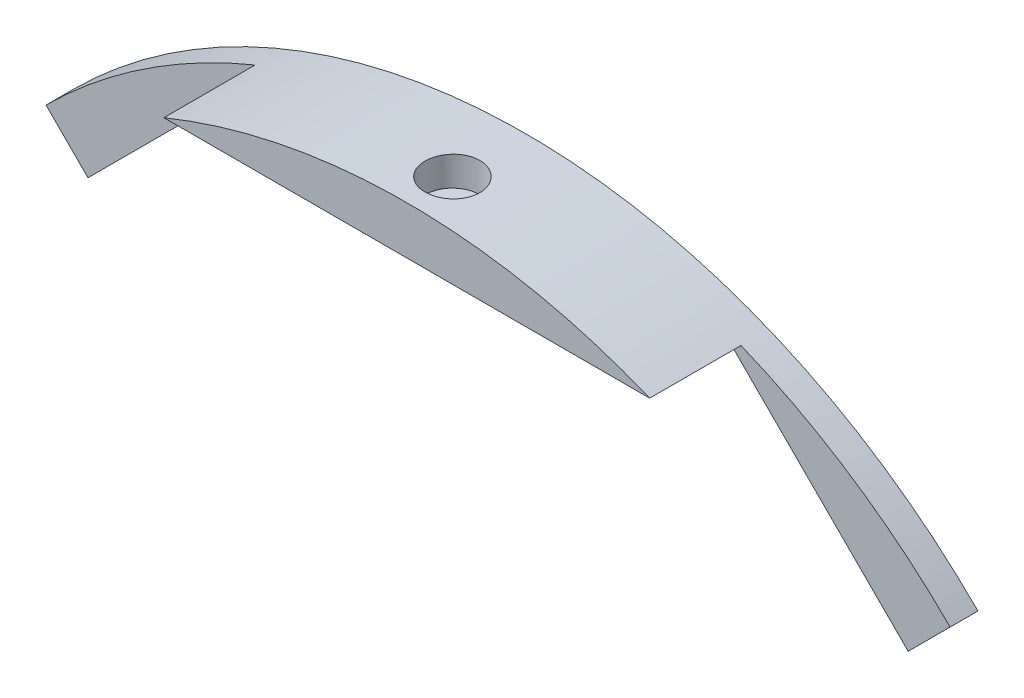
ISO-10303-21;
HEADER;
FILE_DESCRIPTION(('STEP AP214'),'2;1');
FILE_NAME('part.step','',(''),(''),'','','');
FILE_SCHEMA(('AUTOMOTIVE_DESIGN { 1 0 10303 214 1 1 1 1 }'));
ENDSEC;
DATA;
#1=APPLICATION_CONTEXT('core data for automotive mechanical design processes');
#2=APPLICATION_PROTOCOL_DEFINITION('international standard','automotive_design',2000,#1);
#3=PRODUCT_CONTEXT('',#1,'mechanical');
#4=PRODUCT('Part','Part','',(#3));
#5=PRODUCT_RELATED_PRODUCT_CATEGORY('part','',(#4));
#6=PRODUCT_DEFINITION_FORMATION('','',#4);
#7=PRODUCT_DEFINITION_CONTEXT('part definition',#1,'design');
#8=PRODUCT_DEFINITION('design','',#6,#7);
#9=PRODUCT_DEFINITION_SHAPE('','',#8);
#10=(LENGTH_UNIT() NAMED_UNIT(*) SI_UNIT(.MILLI.,.METRE.));
#11=(NAMED_UNIT(*) PLANE_ANGLE_UNIT() SI_UNIT($,.RADIAN.));
#12=(NAMED_UNIT(*) SI_UNIT($,.STERADIAN.) SOLID_ANGLE_UNIT());
#13=UNCERTAINTY_MEASURE_WITH_UNIT(LENGTH_MEASURE(1.E-05),#10,'distance_accuracy_value','');
#14=(GEOMETRIC_REPRESENTATION_CONTEXT(3) GLOBAL_UNCERTAINTY_ASSIGNED_CONTEXT((#13)) GLOBAL_UNIT_ASSIGNED_CONTEXT((#10,
#11,#12)) REPRESENTATION_CONTEXT('',''));
#15=CARTESIAN_POINT('',(0.,0.,0.));
#16=DIRECTION('',(0.,0.,1.));
#17=DIRECTION('',(1.,0.,0.));
#18=AXIS2_PLACEMENT_3D('',#15,#16,#17);
#19=CARTESIAN_POINT('',(1.23866037892397E-11,1.24063554245807E-11,0.));
#20=DIRECTION('',(0.,0.,1.));
#21=DIRECTION('',(1.,0.,0.));
#22=AXIS2_PLACEMENT_3D('',#19,#20,#21);
#23=PLANE('',#22);
#24=DIRECTION('',(1.,0.,0.));
#25=VECTOR('',#24,1.);
#26=CARTESIAN_POINT('',(0.,129.5,0.));
#27=LINE('',#26,#25);
#28=CARTESIAN_POINT('',(-53.1953945375152,129.5,0.));
#29=VERTEX_POINT('',#28);
#30=CARTESIAN_POINT('',(-50.1051224213829,129.5,0.));
#31=VERTEX_POINT('',#30);
#32=EDGE_CURVE('E51',#29,#31,#27,.T.);
#33=ORIENTED_EDGE('',*,*,#32,.F.);
#34=CARTESIAN_POINT('',(1.23866037892397E-11,1.24063554245807E-11,0.));
#35=DIRECTION('',(0.,0.,1.));
#36=DIRECTION('',(1.,0.,0.));
#37=AXIS2_PLACEMENT_3D('',#34,#35,#36);
#38=CIRCLE('',#37,140.);
#39=CARTESIAN_POINT('',(-98.9949493661174,98.994949366116,0.));
#40=VERTEX_POINT('',#39);
#41=EDGE_CURVE('E142',#29,#40,#38,.T.);
#42=ORIENTED_EDGE('',*,*,#41,.T.);
#43=DIRECTION('',(0.70710678118657,-0.707106781186525,0.));
#44=VECTOR('',#43,1.);
#45=CARTESIAN_POINT('',(-89.8025612106907,89.8025612106898,0.));
#46=LINE('',#45,#44);
#47=CARTESIAN_POINT('',(-89.8025612106907,89.8025612106898,0.));
#48=VERTEX_POINT('',#47);
#49=EDGE_CURVE('E147',#40,#48,#46,.T.);
#50=ORIENTED_EDGE('',*,*,#49,.T.);
#51=DIRECTION('',(0.707106781186525,0.70710678118657,0.));
#52=VECTOR('',#51,1.);
#53=CARTESIAN_POINT('',(-89.8025612106907,89.8025612106898,0.));
#54=LINE('',#53,#52);
#55=EDGE_CURVE('E150',#48,#31,#54,.T.);
#56=ORIENTED_EDGE('',*,*,#55,.T.);
#57=EDGE_LOOP('',(#33,#42,#50,#56));
#58=FACE_BOUND('',#57,.T.);
#59=ADVANCED_FACE('F36',(#58),#23,.T.);
#60=CARTESIAN_POINT('',(89.8025612106913,89.8025612106917,-6.1));
#61=DIRECTION('',(0.707106781186548,-0.707106781186548,0.));
#62=DIRECTION('',(0.707106781186548,0.707106781186548,0.));
#63=AXIS2_PLACEMENT_3D('',#60,#61,#62);
#64=PLANE('',#63);
#65=DIRECTION('',(0.707106781186548,0.707106781186548,0.));
#66=VECTOR('',#65,1.);
#67=CARTESIAN_POINT('',(89.8025612106913,89.8025612106917,0.));
#68=LINE('',#67,#66);
#69=CARTESIAN_POINT('',(89.8025612106913,89.8025612106917,0.));
#70=VERTEX_POINT('',#69);
#71=CARTESIAN_POINT('',(98.9949493661289,98.9949493661292,0.));
#72=VERTEX_POINT('',#71);
#73=EDGE_CURVE('E139',#70,#72,#68,.T.);
#74=ORIENTED_EDGE('',*,*,#73,.F.);
#75=DIRECTION('',(0.,0.,1.));
#76=VECTOR('',#75,1.);
#77=CARTESIAN_POINT('',(89.8025612106913,89.8025612106917,-6.1));
#78=LINE('',#77,#76);
#79=CARTESIAN_POINT('',(89.8025612106913,89.8025612106917,-6.1));
#80=VERTEX_POINT('',#79);
#81=EDGE_CURVE('E49',#80,#70,#78,.T.);
#82=ORIENTED_EDGE('',*,*,#81,.F.);
#83=DIRECTION('',(0.707106781186548,0.707106781186548,0.));
#84=VECTOR('',#83,1.);
#85=CARTESIAN_POINT('',(89.8025612106913,89.8025612106917,-6.1));
#86=LINE('',#85,#84);
#87=CARTESIAN_POINT('',(98.9949493661289,98.9949493661292,-6.1));
#88=VERTEX_POINT('',#87);
#89=EDGE_CURVE('E155',#80,#88,#86,.T.);
#90=ORIENTED_EDGE('',*,*,#89,.T.);
#91=DIRECTION('',(0.,0.,1.));
#92=VECTOR('',#91,1.);
#93=CARTESIAN_POINT('',(98.9949493661289,98.9949493661292,-6.1));
#94=LINE('',#93,#92);
#95=EDGE_CURVE('E97',#88,#72,#94,.T.);
#96=ORIENTED_EDGE('',*,*,#95,.T.);
#97=EDGE_LOOP('',(#74,#82,#90,#96));
#98=FACE_BOUND('',#97,.T.);
#99=ADVANCED_FACE('F38',(#98),#64,.T.);
#100=CARTESIAN_POINT('',(50.105122421383,129.5,-6.1));
#101=DIRECTION('',(-0.707106781186548,-0.707106781186547,0.));
#102=DIRECTION('',(0.707106781186547,-0.707106781186548,0.));
#103=AXIS2_PLACEMENT_3D('',#100,#101,#102);
#104=PLANE('',#103);
#105=DIRECTION('',(0.707106781186547,-0.707106781186548,0.));
#106=VECTOR('',#105,1.);
#107=CARTESIAN_POINT('',(50.105122421383,129.5,0.));
#108=LINE('',#107,#106);
#109=CARTESIAN_POINT('',(50.105122421383,129.5,0.));
#110=VERTEX_POINT('',#109);
#111=EDGE_CURVE('E152',#110,#70,#108,.T.);
#112=ORIENTED_EDGE('',*,*,#111,.F.);
#113=DIRECTION('',(0.,0.,1.));
#114=VECTOR('',#113,1.);
#115=CARTESIAN_POINT('',(50.105122421383,129.5,-6.1));
#116=LINE('',#115,#114);
#117=CARTESIAN_POINT('',(50.105122421383,129.5,-6.1));
#118=VERTEX_POINT('',#117);
#119=EDGE_CURVE('E120',#118,#110,#116,.T.);
#120=ORIENTED_EDGE('',*,*,#119,.F.);
#121=DIRECTION('',(0.707106781186547,-0.707106781186548,0.));
#122=VECTOR('',#121,1.);
#123=CARTESIAN_POINT('',(50.105122421383,129.5,-6.1));
#124=LINE('',#123,#122);
#125=EDGE_CURVE('E129',#118,#80,#124,.T.);
#126=ORIENTED_EDGE('',*,*,#125,.T.);
#127=ORIENTED_EDGE('',*,*,#81,.T.);
#128=EDGE_LOOP('',(#112,#120,#126,#127));
#129=FACE_BOUND('',#128,.T.);
#130=ADVANCED_FACE('F192',(#129),#104,.T.);
#131=CARTESIAN_POINT('',(50.105122421383,129.5,-6.1));
#132=DIRECTION('',(0.,-1.,0.));
#133=DIRECTION('',(0.,0.,-1.));
#134=AXIS2_PLACEMENT_3D('',#131,#132,#133);
#135=PLANE('',#134);
#136=CARTESIAN_POINT('',(0.,129.5,10.));
#137=DIRECTION('',(0.,-1.,0.));
#138=DIRECTION('',(0.,0.,-1.));
#139=AXIS2_PLACEMENT_3D('',#136,#137,#138);
#140=CIRCLE('',#139,2.75);
#141=CARTESIAN_POINT('',(0.,129.5,7.25));
#142=VERTEX_POINT('',#141);
#143=EDGE_CURVE('E168',#142,#142,#140,.T.);
#144=ORIENTED_EDGE('',*,*,#143,.F.);
#145=EDGE_LOOP('',(#144));
#146=FACE_BOUND('',#145,.T.);
#147=ORIENTED_EDGE('',*,*,#119,.T.);
#148=CARTESIAN_POINT('',(53.195394537517,129.500000000004,0.));
#149=VERTEX_POINT('',#148);
#150=EDGE_CURVE('E11',#110,#149,#27,.T.);
#151=ORIENTED_EDGE('',*,*,#150,.T.);
#152=DIRECTION('',(0.,0.,-1.));
#153=VECTOR('',#152,1.);
#154=CARTESIAN_POINT('',(53.195394537517,129.500000000004,20.));
#155=LINE('',#154,#153);
#156=CARTESIAN_POINT('',(53.195394537517,129.500000000004,20.));
#157=VERTEX_POINT('',#156);
#158=EDGE_CURVE('E143',#157,#149,#155,.T.);
#159=ORIENTED_EDGE('',*,*,#158,.F.);
#160=DIRECTION('',(1.,0.,0.));
#161=VECTOR('',#160,1.);
#162=CARTESIAN_POINT('',(0.,129.5,20.));
#163=LINE('',#162,#161);
#164=CARTESIAN_POINT('',(-53.1953945375152,129.5,20.));
#165=VERTEX_POINT('',#164);
#166=EDGE_CURVE('E176',#165,#157,#163,.T.);
#167=ORIENTED_EDGE('',*,*,#166,.F.);
#168=DIRECTION('',(0.,0.,-1.));
#169=VECTOR('',#168,1.);
#170=CARTESIAN_POINT('',(-53.1953945375152,129.5,20.));
#171=LINE('',#170,#169);
#172=EDGE_CURVE('E181',#165,#29,#171,.T.);
#173=ORIENTED_EDGE('',*,*,#172,.T.);
#174=ORIENTED_EDGE('',*,*,#32,.T.);
#175=DIRECTION('',(0.,0.,1.));
#176=VECTOR('',#175,1.);
#177=CARTESIAN_POINT('',(-50.1051224213829,129.5,-6.1));
#178=LINE('',#177,#176);
#179=CARTESIAN_POINT('',(-50.1051224213829,129.5,-6.1));
#180=VERTEX_POINT('',#179);
#181=EDGE_CURVE('E110',#180,#31,#178,.T.);
#182=ORIENTED_EDGE('',*,*,#181,.F.);
#183=DIRECTION('',(1.,0.,0.));
#184=VECTOR('',#183,1.);
#185=CARTESIAN_POINT('',(50.105122421383,129.5,-6.1));
#186=LINE('',#185,#184);
#187=EDGE_CURVE('E114',#180,#118,#186,.T.);
#188=ORIENTED_EDGE('',*,*,#187,.T.);
#189=EDGE_LOOP('',(#147,#151,#159,#167,#173,#174,#182,#188));
#190=FACE_BOUND('',#189,.T.);
#191=ADVANCED_FACE('F113',(#146,#190),#135,.T.);
#192=CARTESIAN_POINT('',(-89.8025612106907,89.8025612106898,-6.1));
#193=DIRECTION('',(0.70710678118657,-0.707106781186525,0.));
#194=DIRECTION('',(0.707106781186525,0.70710678118657,0.));
#195=AXIS2_PLACEMENT_3D('',#192,#193,#194);
#196=PLANE('',#195);
#197=ORIENTED_EDGE('',*,*,#55,.F.);
#198=DIRECTION('',(0.,0.,1.));
#199=VECTOR('',#198,1.);
#200=CARTESIAN_POINT('',(-89.8025612106907,89.8025612106898,-6.1));
#201=LINE('',#200,#199);
#202=CARTESIAN_POINT('',(-89.8025612106907,89.8025612106898,-6.1));
#203=VERTEX_POINT('',#202);
#204=EDGE_CURVE('E121',#203,#48,#201,.T.);
#205=ORIENTED_EDGE('',*,*,#204,.F.);
#206=DIRECTION('',(0.707106781186525,0.70710678118657,0.));
#207=VECTOR('',#206,1.);
#208=CARTESIAN_POINT('',(-89.8025612106907,89.8025612106898,-6.1));
#209=LINE('',#208,#207);
#210=EDGE_CURVE('E127',#203,#180,#209,.T.);
#211=ORIENTED_EDGE('',*,*,#210,.T.);
#212=ORIENTED_EDGE('',*,*,#181,.T.);
#213=EDGE_LOOP('',(#197,#205,#211,#212));
#214=FACE_BOUND('',#213,.T.);
#215=ADVANCED_FACE('F131',(#214),#196,.T.);
#216=CARTESIAN_POINT('',(-89.8025612106907,89.8025612106898,-6.1));
#217=DIRECTION('',(-0.707106781186525,-0.70710678118657,0.));
#218=DIRECTION('',(0.70710678118657,-0.707106781186525,0.));
#219=AXIS2_PLACEMENT_3D('',#216,#217,#218);
#220=PLANE('',#219);
#221=ORIENTED_EDGE('',*,*,#49,.F.);
#222=DIRECTION('',(0.,0.,1.));
#223=VECTOR('',#222,1.);
#224=CARTESIAN_POINT('',(-98.9949493661174,98.994949366116,-6.1));
#225=LINE('',#224,#223);
#226=CARTESIAN_POINT('',(-98.9949493661174,98.994949366116,-6.1));
#227=VERTEX_POINT('',#226);
#228=EDGE_CURVE('E159',#227,#40,#225,.T.);
#229=ORIENTED_EDGE('',*,*,#228,.F.);
#230=DIRECTION('',(0.70710678118657,-0.707106781186525,0.));
#231=VECTOR('',#230,1.);
#232=CARTESIAN_POINT('',(-89.8025612106907,89.8025612106898,-6.1));
#233=LINE('',#232,#231);
#234=EDGE_CURVE('E132',#227,#203,#233,.T.);
#235=ORIENTED_EDGE('',*,*,#234,.T.);
#236=ORIENTED_EDGE('',*,*,#204,.T.);
#237=EDGE_LOOP('',(#221,#229,#235,#236));
#238=FACE_BOUND('',#237,.T.);
#239=ADVANCED_FACE('F200',(#238),#220,.T.);
#240=CARTESIAN_POINT('',(1.23866037892397E-11,1.24063554245807E-11,-6.1));
#241=DIRECTION('',(0.,0.,1.));
#242=DIRECTION('',(1.,0.,0.));
#243=AXIS2_PLACEMENT_3D('',#240,#241,#242);
#244=CYLINDRICAL_SURFACE('',#243,140.);
#245=CARTESIAN_POINT('',(0.,140.000000000012,4.));
#246=CARTESIAN_POINT('',(-0.168488805139815,140.000000152938,3.99999871263756));
#247=CARTESIAN_POINT('',(-0.336956773116607,139.999695201628,4.00709999346047));
#248=CARTESIAN_POINT('',(-0.672750348498297,139.998484241626,4.03545498150821));
#249=CARTESIAN_POINT('',(-0.840075648906144,139.997578077366,4.05671235171755));
#250=CARTESIAN_POINT('',(-1.17248201577956,139.995188993006,4.11325756915802));
#251=CARTESIAN_POINT('',(-1.33756099126341,139.993705569128,4.1485576721955));
#252=CARTESIAN_POINT('',(-1.66421422661113,139.990203514161,4.23295079299528));
#253=CARTESIAN_POINT('',(-1.82578718218924,139.988184687467,4.28204885213396));
#254=CARTESIAN_POINT('',(-2.14407685150248,139.983671361638,4.3936330856253));
#255=CARTESIAN_POINT('',(-2.30079766521677,139.981177277588,4.45610758297901));
#256=CARTESIAN_POINT('',(-2.6084748567054,139.975781991734,4.59405025791866));
#257=CARTESIAN_POINT('',(-2.75942908771548,139.972880640158,4.66952321802868));
#258=CARTESIAN_POINT('',(-3.05435081890399,139.966755644559,4.83285975677003));
#259=CARTESIAN_POINT('',(-3.19832251927118,139.963532197948,4.92071575921903));
#260=CARTESIAN_POINT('',(-3.47840974373095,139.956851565558,5.10826391726166));
#261=CARTESIAN_POINT('',(-3.61452234668827,139.953394293891,5.20796043228119));
#262=CARTESIAN_POINT('',(-3.87791007016635,139.946343927667,5.41848866736161));
#263=CARTESIAN_POINT('',(-4.00518244870239,139.942750791498,5.52932381645559));
#264=CARTESIAN_POINT('',(-4.24998660947531,139.935530223377,5.76136026179769));
#265=CARTESIAN_POINT('',(-4.36751477690093,139.93190277925,5.88256537141078));
#266=CARTESIAN_POINT('',(-4.59190708347003,139.924719011407,6.13440513277447));
#267=CARTESIAN_POINT('',(-4.6987747126674,139.921162664721,6.26503667419725));
#268=CARTESIAN_POINT('',(-4.90116879667232,139.914219452404,6.53488800524667));
#269=CARTESIAN_POINT('',(-4.99669105003866,139.910832649824,6.67411094763468));
#270=CARTESIAN_POINT('',(-5.17566936860571,139.90432613098,6.96011466795623));
#271=CARTESIAN_POINT('',(-5.25912544071087,139.901206414563,7.10689544156502));
#272=CARTESIAN_POINT('',(-5.41340572808223,139.895321581173,7.40702413077778));
#273=CARTESIAN_POINT('',(-5.4842252655539,139.892556595621,7.56037445235584));
#274=CARTESIAN_POINT('',(-5.61266564428977,139.887462369762,7.87245879454198));
#275=CARTESIAN_POINT('',(-5.67029141633421,139.885132966729,8.03119077836716));
#276=CARTESIAN_POINT('',(-5.77198382908236,139.880973517232,8.35296392003654));
#277=CARTESIAN_POINT('',(-5.81604545973883,139.879143655307,8.5160066460081));
#278=CARTESIAN_POINT('',(-5.92725912304452,139.874491705098,9.00954918717552));
#279=CARTESIAN_POINT('',(-5.97365979199516,139.872498234285,9.34499902290213));
#280=CARTESIAN_POINT('',(-6.0094610338478,139.870964272836,10.0187500272859));
#281=CARTESIAN_POINT('',(-5.99886196436982,139.87142376681,10.3570511780404));
#282=CARTESIAN_POINT('',(-5.92106705532725,139.874738480679,11.0268896837764));
#283=CARTESIAN_POINT('',(-5.85390849054236,139.877592122739,11.3584313461575));
#284=CARTESIAN_POINT('',(-5.66493900066883,139.885372103493,12.0055175943589));
#285=CARTESIAN_POINT('',(-5.54312789039569,139.890298449211,12.3210621259705));
#286=CARTESIAN_POINT('',(-5.24827367298273,139.90167007784,12.9273330863853));
#287=CARTESIAN_POINT('',(-5.07521352845062,139.908115865735,13.2180512203474));
#288=CARTESIAN_POINT('',(-4.68278484506125,139.921799382556,13.7663218898595));
#289=CARTESIAN_POINT('',(-4.46341607094607,139.929037115506,14.0238742569095));
#290=CARTESIAN_POINT('',(-3.98438697643565,139.943495698097,14.4987206380602));
#291=CARTESIAN_POINT('',(-3.72469435557091,139.950716529451,14.7159820692094));
#292=CARTESIAN_POINT('',(-3.17250286185606,139.964321777914,15.1038280381154));
#293=CARTESIAN_POINT('',(-2.88000398221976,139.970706194851,15.2744125662169));
#294=CARTESIAN_POINT('',(-2.27048427780585,139.981919209328,15.5640592210487));
#295=CARTESIAN_POINT('',(-1.95346293401941,139.986747773927,15.6831202569515));
#296=CARTESIAN_POINT('',(-1.30390568192815,139.994304352333,15.8663191103882));
#297=CARTESIAN_POINT('',(-0.97136985912734,139.997032377714,15.9304572305776));
#298=CARTESIAN_POINT('',(-0.300506091921123,140.000078913982,16.0019495524794));
#299=CARTESIAN_POINT('',(0.0378170405148332,140.00039933759,16.0093488305216));
#300=CARTESIAN_POINT('',(0.710900348117241,139.998599628989,15.9672709877728));
#301=CARTESIAN_POINT('',(1.04566053188787,139.996479502675,15.9177940043639));
#302=CARTESIAN_POINT('',(1.7019893003169,139.990038780584,15.7634054380892));
#303=CARTESIAN_POINT('',(2.02356272399622,139.985718999945,15.6585143897606));
#304=CARTESIAN_POINT('',(2.64453855702283,139.975365493009,15.3962958949145));
#305=CARTESIAN_POINT('',(2.94394087300607,139.969331759494,15.2389682275982));
#306=CARTESIAN_POINT('',(3.51228279448719,139.956224730366,14.8762270745953));
#307=CARTESIAN_POINT('',(3.78120306666198,139.949150781454,14.6707833215996));
#308=CARTESIAN_POINT('',(4.28075281738434,139.934762417241,14.2176848998475));
#309=CARTESIAN_POINT('',(4.5113821117542,139.927448000784,13.9700300280692));
#310=CARTESIAN_POINT('',(4.92795494607619,139.913397688534,13.4393502406555));
#311=CARTESIAN_POINT('',(5.11386935695485,139.906662171687,13.1563024501172));
#312=CARTESIAN_POINT('',(5.43553413898071,139.894535263253,12.5629707449778));
#313=CARTESIAN_POINT('',(5.57128468500877,139.889143866981,12.2526869253315));
#314=CARTESIAN_POINT('',(5.78872406315523,139.88031515458,11.6138620793109));
#315=CARTESIAN_POINT('',(5.87043157659746,139.876877163265,11.2853274044139));
#316=CARTESIAN_POINT('',(5.97750161834169,139.872343531276,10.6190042393699));
#317=CARTESIAN_POINT('',(6.0028643542294,139.871247881972,10.2812157833203));
#318=CARTESIAN_POINT('',(5.99817593804806,139.871447087875,9.77540506641804));
#319=CARTESIAN_POINT('',(5.98948698725467,139.871820778037,9.60692413751526));
#320=CARTESIAN_POINT('',(5.95796633062812,139.873167307899,9.27130973087125));
#321=CARTESIAN_POINT('',(5.93513985055662,139.874139926212,9.10417577835092));
#322=CARTESIAN_POINT('',(5.87548980550892,139.876658155372,8.77237722616152));
#323=CARTESIAN_POINT('',(5.83866105864305,139.878203978342,8.60771356416383));
#324=CARTESIAN_POINT('',(5.75128933379319,139.881823634464,8.2821337211927));
#325=CARTESIAN_POINT('',(5.70075141239007,139.883897272915,8.1212161821905));
#326=CARTESIAN_POINT('',(5.58629307439713,139.888514924509,7.80415171680108));
#327=CARTESIAN_POINT('',(5.5223675821944,139.891059116009,7.64800662558936));
#328=CARTESIAN_POINT('',(5.38162733573108,139.896544066924,7.34171445662499));
#329=CARTESIAN_POINT('',(5.30481733678649,139.899484679953,7.1915651911982));
#330=CARTESIAN_POINT('',(5.13880975429503,139.905680843105,6.89821880719277));
#331=CARTESIAN_POINT('',(5.0496080357602,139.908936498244,6.75502403087045));
#332=CARTESIAN_POINT('',(4.85950524674224,139.915668341958,6.47670632627825));
#333=CARTESIAN_POINT('',(4.75860849265268,139.919144448956,6.34158044766994));
#334=CARTESIAN_POINT('',(4.54569091318352,139.92622358951,6.08016034597981));
#335=CARTESIAN_POINT('',(4.43365834643534,139.929826754396,5.95387568912396));
#336=CARTESIAN_POINT('',(4.19939762592709,139.93705293057,5.71123711416808));
#337=CARTESIAN_POINT('',(4.07717324149952,139.940675934063,5.59487955656716));
#338=CARTESIAN_POINT('',(3.82328125646188,139.947842620646,5.37279965991994));
#339=CARTESIAN_POINT('',(3.69160788509067,139.9513862535,5.26708391645858));
#340=CARTESIAN_POINT('',(3.41986937721776,139.958290055071,5.06715738846665));
#341=CARTESIAN_POINT('',(3.279807352834,139.961650290953,4.9729423761938));
#342=CARTESIAN_POINT('',(2.99206810329553,139.968097285642,4.79653572594455));
#343=CARTESIAN_POINT('',(2.84438195177334,139.97118371183,4.71435863454928));
#344=CARTESIAN_POINT('',(2.54265596167764,139.976989746291,4.56277689171389));
#345=CARTESIAN_POINT('',(2.38861846771846,139.979709488372,4.49336757778578));
#346=CARTESIAN_POINT('',(2.07536891835933,139.984703994514,4.36783461257965));
#347=CARTESIAN_POINT('',(1.916161528127,139.986979147426,4.31169934236268));
#348=CARTESIAN_POINT('',(1.5936312690351,139.991022407216,4.21305100810472));
#349=CARTESIAN_POINT('',(1.43030948056402,139.992790645724,4.17053440737469));
#350=CARTESIAN_POINT('',(1.05776447243564,139.996157891428,4.09015547629824));
#351=CARTESIAN_POINT('',(0.847646207084257,139.997593399777,4.05637653730123));
#352=CARTESIAN_POINT('',(0.425007579923997,139.999514357347,4.01129961784719));
#353=CARTESIAN_POINT('',(0.212487219595254,139.999999807153,4.00000162353852));
#354=CARTESIAN_POINT('',(0.,140.000000000012,4.));
#355=B_SPLINE_CURVE_WITH_KNOTS('',3,(#245,#246,#247,#248,#249,#250,#251,#252,#253,#254,#255,
#256,#257,#258,#259,#260,#261,#262,#263,#264,#265,#266,#267,#268,#269,#270,#271,#272,#273,#274,
#275,#276,#277,#278,#279,#280,#281,#282,#283,#284,#285,#286,#287,#288,#289,#290,#291,#292,#293,
#294,#295,#296,#297,#298,#299,#300,#301,#302,#303,#304,#305,#306,#307,#308,#309,#310,#311,#312,
#313,#314,#315,#316,#317,#318,#319,#320,#321,#322,#323,#324,#325,#326,#327,#328,#329,#330,#331,
#332,#333,#334,#335,#336,#337,#338,#339,#340,#341,#342,#343,#344,#345,#346,#347,#348,#349,#350,
#351,#352,#353,#354),.UNSPECIFIED.,.T.,.F.,(4,2,2,2,2,2,2,2,2,2,2,2,2,2,2,2,2,2,2,2,2,2,2,2,2,2,
2,2,2,2,2,2,2,2,2,2,2,2,2,2,2,2,2,2,2,2,2,2,2,2,2,2,2,2,4),(0.,0.505280774847108,
1.01069234536327,1.51654598536992,2.02258469058248,2.52818343596041,3.03396860523845,
3.53944565798456,4.04510939699987,4.55092928445606,5.05693598412258,5.56277647954728,
6.06880371855463,6.57483066800518,7.08104455172403,7.58706894302375,8.09328001570793,
9.10398680985175,10.1146872627638,11.1247221478142,12.1347604552892,13.1451349207913,
14.1555145193393,15.1667076741112,16.1779010380548,17.1891158093886,18.2003250083341,
19.2107307660266,20.2211340831331,21.2311632420529,22.241196654032,23.2518671397571,
24.2625424866161,25.2738744554953,26.285202898644,27.2961815679009,28.3071565124991,
28.8127805122597,29.3182177258567,29.8238421715155,30.3292803723649,30.8349105474012,
31.3403545172298,31.8459675554118,32.3513945730347,32.8573602722253,33.3631396684967,
33.86923063134,34.3751349880425,34.8816457221808,35.3879711218777,35.8938516742551,
36.3996007456914,37.0368286791828,37.6740562200458),.UNSPECIFIED.);
#356=CARTESIAN_POINT('',(0.,140.000000000012,4.));
#357=VERTEX_POINT('',#356);
#358=EDGE_CURVE('E40',#357,#357,#355,.T.);
#359=ORIENTED_EDGE('',*,*,#358,.F.);
#360=EDGE_LOOP('',(#359));
#361=FACE_BOUND('',#360,.T.);
#362=EDGE_CURVE('E144',#72,#149,#38,.T.);
#363=ORIENTED_EDGE('',*,*,#362,.F.);
#364=ORIENTED_EDGE('',*,*,#95,.F.);
#365=CARTESIAN_POINT('',(1.23866037892397E-11,1.24063554245807E-11,-6.1));
#366=DIRECTION('',(0.,0.,1.));
#367=DIRECTION('',(1.,0.,0.));
#368=AXIS2_PLACEMENT_3D('',#365,#366,#367);
#369=CIRCLE('',#368,140.);
#370=EDGE_CURVE('E134',#88,#227,#369,.T.);
#371=ORIENTED_EDGE('',*,*,#370,.T.);
#372=ORIENTED_EDGE('',*,*,#228,.T.);
#373=ORIENTED_EDGE('',*,*,#41,.F.);
#374=ORIENTED_EDGE('',*,*,#172,.F.);
#375=CARTESIAN_POINT('',(1.23866037892397E-11,1.24063554245807E-11,20.));
#376=DIRECTION('',(0.,0.,1.));
#377=DIRECTION('',(1.,0.,0.));
#378=AXIS2_PLACEMENT_3D('',#375,#376,#377);
#379=CIRCLE('',#378,139.999999999995);
#380=EDGE_CURVE('E179',#157,#165,#379,.T.);
#381=ORIENTED_EDGE('',*,*,#380,.F.);
#382=ORIENTED_EDGE('',*,*,#158,.T.);
#383=EDGE_LOOP('',(#363,#364,#371,#372,#373,#374,#381,#382));
#384=FACE_BOUND('',#383,.T.);
#385=ADVANCED_FACE('F186',(#361,#384),#244,.T.);
#386=CARTESIAN_POINT('',(1.23866037892397E-11,1.24063554245807E-11,-6.1));
#387=DIRECTION('',(0.,0.,1.));
#388=DIRECTION('',(1.,0.,0.));
#389=AXIS2_PLACEMENT_3D('',#386,#387,#388);
#390=PLANE('',#389);
#391=ORIENTED_EDGE('',*,*,#89,.F.);
#392=ORIENTED_EDGE('',*,*,#125,.F.);
#393=ORIENTED_EDGE('',*,*,#187,.F.);
#394=ORIENTED_EDGE('',*,*,#210,.F.);
#395=ORIENTED_EDGE('',*,*,#234,.F.);
#396=ORIENTED_EDGE('',*,*,#370,.F.);
#397=EDGE_LOOP('',(#391,#392,#393,#394,#395,#396));
#398=FACE_BOUND('',#397,.T.);
#399=ADVANCED_FACE('F125',(#398),#390,.F.);
#400=ORIENTED_EDGE('',*,*,#150,.F.);
#401=ORIENTED_EDGE('',*,*,#111,.T.);
#402=ORIENTED_EDGE('',*,*,#73,.T.);
#403=ORIENTED_EDGE('',*,*,#362,.T.);
#404=EDGE_LOOP('',(#400,#401,#402,#403));
#405=FACE_BOUND('',#404,.T.);
#406=ADVANCED_FACE('F191',(#405),#23,.T.);
#407=CARTESIAN_POINT('',(1.23866037892397E-11,1.24063554245807E-11,20.));
#408=DIRECTION('',(0.,0.,1.));
#409=DIRECTION('',(1.,0.,0.));
#410=AXIS2_PLACEMENT_3D('',#407,#408,#409);
#411=PLANE('',#410);
#412=ORIENTED_EDGE('',*,*,#166,.T.);
#413=ORIENTED_EDGE('',*,*,#380,.T.);
#414=EDGE_LOOP('',(#412,#413));
#415=FACE_BOUND('',#414,.T.);
#416=ADVANCED_FACE('F198',(#415),#411,.T.);
#417=CARTESIAN_POINT('',(0.,140.000000000012,10.));
#418=DIRECTION('',(0.,-1.,0.));
#419=DIRECTION('',(0.,0.,-1.));
#420=AXIS2_PLACEMENT_3D('',#417,#418,#419);
#421=CYLINDRICAL_SURFACE('',#420,2.75);
#422=CARTESIAN_POINT('',(0.,133.5,10.));
#423=DIRECTION('',(0.,-1.,0.));
#424=DIRECTION('',(0.,0.,-1.));
#425=AXIS2_PLACEMENT_3D('',#422,#423,#424);
#426=CIRCLE('',#425,2.75);
#427=CARTESIAN_POINT('',(0.,133.5,7.25));
#428=VERTEX_POINT('',#427);
#429=EDGE_CURVE('E162',#428,#428,#426,.F.);
#430=CARTESIAN_POINT('',(0.,133.5,7.25));
#431=CARTESIAN_POINT('',(0.,133.458333333333,7.25));
#432=CARTESIAN_POINT('',(0.,133.416666666667,7.25));
#433=CARTESIAN_POINT('',(0.,133.333333333333,7.25));
#434=CARTESIAN_POINT('',(0.,133.291666666667,7.25));
#435=CARTESIAN_POINT('',(0.,133.208333333333,7.25));
#436=CARTESIAN_POINT('',(0.,133.166666666667,7.25));
#437=CARTESIAN_POINT('',(0.,133.083333333333,7.25));
#438=CARTESIAN_POINT('',(0.,133.041666666667,7.25));
#439=CARTESIAN_POINT('',(0.,132.958333333333,7.25));
#440=CARTESIAN_POINT('',(0.,132.916666666667,7.25));
#441=CARTESIAN_POINT('',(0.,132.833333333333,7.25));
#442=CARTESIAN_POINT('',(0.,132.791666666667,7.25));
#443=CARTESIAN_POINT('',(0.,132.708333333333,7.25));
#444=CARTESIAN_POINT('',(0.,132.666666666667,7.25));
#445=CARTESIAN_POINT('',(0.,132.583333333333,7.25));
#446=CARTESIAN_POINT('',(0.,132.541666666667,7.25));
#447=CARTESIAN_POINT('',(0.,132.458333333333,7.25));
#448=CARTESIAN_POINT('',(0.,132.416666666667,7.25));
#449=CARTESIAN_POINT('',(0.,132.333333333333,7.25));
#450=CARTESIAN_POINT('',(0.,132.291666666667,7.25));
#451=CARTESIAN_POINT('',(0.,132.208333333333,7.25));
#452=CARTESIAN_POINT('',(0.,132.166666666667,7.25));
#453=CARTESIAN_POINT('',(0.,132.083333333333,7.25));
#454=CARTESIAN_POINT('',(0.,132.041666666667,7.25));
#455=CARTESIAN_POINT('',(0.,131.958333333333,7.25));
#456=CARTESIAN_POINT('',(0.,131.916666666667,7.25));
#457=CARTESIAN_POINT('',(0.,131.833333333333,7.25));
#458=CARTESIAN_POINT('',(0.,131.791666666667,7.25));
#459=CARTESIAN_POINT('',(0.,131.708333333333,7.25));
#460=CARTESIAN_POINT('',(0.,131.666666666667,7.25));
#461=CARTESIAN_POINT('',(0.,131.583333333333,7.25));
#462=CARTESIAN_POINT('',(0.,131.541666666667,7.25));
#463=CARTESIAN_POINT('',(0.,131.458333333333,7.25));
#464=CARTESIAN_POINT('',(0.,131.416666666667,7.25));
#465=CARTESIAN_POINT('',(0.,131.333333333333,7.25));
#466=CARTESIAN_POINT('',(0.,131.291666666667,7.25));
#467=CARTESIAN_POINT('',(0.,131.208333333333,7.25));
#468=CARTESIAN_POINT('',(0.,131.166666666667,7.25));
#469=CARTESIAN_POINT('',(0.,131.083333333333,7.25));
#470=CARTESIAN_POINT('',(0.,131.041666666667,7.25));
#471=CARTESIAN_POINT('',(0.,130.958333333333,7.25));
#472=CARTESIAN_POINT('',(0.,130.916666666667,7.25));
#473=CARTESIAN_POINT('',(0.,130.833333333333,7.25));
#474=CARTESIAN_POINT('',(0.,130.791666666667,7.25));
#475=CARTESIAN_POINT('',(0.,130.708333333333,7.25));
#476=CARTESIAN_POINT('',(0.,130.666666666667,7.25));
#477=CARTESIAN_POINT('',(0.,130.583333333333,7.25));
#478=CARTESIAN_POINT('',(0.,130.541666666667,7.25));
#479=CARTESIAN_POINT('',(0.,130.458333333333,7.25));
#480=CARTESIAN_POINT('',(0.,130.416666666667,7.25));
#481=CARTESIAN_POINT('',(0.,130.333333333333,7.25));
#482=CARTESIAN_POINT('',(0.,130.291666666667,7.25));
#483=CARTESIAN_POINT('',(0.,130.208333333333,7.25));
#484=CARTESIAN_POINT('',(0.,130.166666666667,7.25));
#485=CARTESIAN_POINT('',(0.,130.083333333333,7.25));
#486=CARTESIAN_POINT('',(0.,130.041666666667,7.25));
#487=CARTESIAN_POINT('',(0.,129.958333333333,7.25));
#488=CARTESIAN_POINT('',(0.,129.916666666667,7.25));
#489=CARTESIAN_POINT('',(0.,129.833333333333,7.25));
#490=CARTESIAN_POINT('',(0.,129.791666666667,7.25));
#491=CARTESIAN_POINT('',(0.,129.708333333333,7.25));
#492=CARTESIAN_POINT('',(0.,129.666666666667,7.25));
#493=CARTESIAN_POINT('',(0.,129.583333333333,7.25));
#494=CARTESIAN_POINT('',(0.,129.541666666667,7.25));
#495=CARTESIAN_POINT('',(0.,129.5,7.25));
#496=B_SPLINE_CURVE_WITH_KNOTS('',3,(#430,#431,#432,#433,#434,#435,#436,#437,#438,#439,#440,
#441,#442,#443,#444,#445,#446,#447,#448,#449,#450,#451,#452,#453,#454,#455,#456,#457,#458,#459,
#460,#461,#462,#463,#464,#465,#466,#467,#468,#469,#470,#471,#472,#473,#474,#475,#476,#477,#478,
#479,#480,#481,#482,#483,#484,#485,#486,#487,#488,#489,#490,#491,#492,#493,#494,#495),
.UNSPECIFIED.,.F.,.F.,(4,2,2,2,2,2,2,2,2,2,2,2,2,2,2,2,2,2,2,2,2,2,2,2,2,2,2,2,2,2,2,2,4),(0.,
0.125000000000014,0.25,0.375000000000014,0.5,0.625000000000014,0.750000000000001,
0.875000000000015,1.,1.12500000000001,1.25,1.37500000000002,1.5,1.62500000000002,1.75,
1.87500000000002,2.,2.12500000000002,2.25,2.37500000000002,2.5,2.62500000000002,2.75,
2.87500000000002,3.,3.12500000000002,3.25,3.37500000000002,3.5,3.62500000000002,3.75,
3.87500000000002,4.),.UNSPECIFIED.);
#497=EDGE_CURVE('BSEAM221',#428,#142,#496,.T.);
#498=ORIENTED_EDGE('',*,*,#429,.T.);
#499=ORIENTED_EDGE('',*,*,#143,.T.);
#500=ORIENTED_EDGE('',*,*,#497,.T.);
#501=ORIENTED_EDGE('',*,*,#497,.F.);
#502=EDGE_LOOP('',(#498,#500,#499,#501));
#503=FACE_BOUND('',#502,.T.);
#504=ADVANCED_FACE('F221',(#503),#421,.F.);
#505=CARTESIAN_POINT('',(0.,133.5,10.));
#506=DIRECTION('',(0.,-1.,0.));
#507=DIRECTION('',(0.,0.,-1.));
#508=AXIS2_PLACEMENT_3D('',#505,#506,#507);
#509=PLANE('',#508);
#510=CARTESIAN_POINT('',(0.,133.5,10.));
#511=DIRECTION('',(0.,-1.,0.));
#512=DIRECTION('',(0.,0.,-1.));
#513=AXIS2_PLACEMENT_3D('',#510,#511,#512);
#514=CIRCLE('',#513,6.);
#515=CARTESIAN_POINT('',(0.,133.5,4.));
#516=VERTEX_POINT('',#515);
#517=EDGE_CURVE('E164',#516,#516,#514,.T.);
#518=ORIENTED_EDGE('',*,*,#517,.F.);
#519=EDGE_LOOP('',(#518));
#520=FACE_BOUND('',#519,.T.);
#521=ORIENTED_EDGE('',*,*,#429,.F.);
#522=EDGE_LOOP('',(#521));
#523=FACE_BOUND('',#522,.T.);
#524=ADVANCED_FACE('F227',(#520,#523),#509,.F.);
#525=CARTESIAN_POINT('',(0.,153.5,10.));
#526=DIRECTION('',(0.,-1.,0.));
#527=DIRECTION('',(0.,0.,-1.));
#528=AXIS2_PLACEMENT_3D('',#525,#526,#527);
#529=CYLINDRICAL_SURFACE('',#528,6.);
#530=ORIENTED_EDGE('',*,*,#358,.T.);
#531=EDGE_LOOP('',(#530));
#532=FACE_BOUND('',#531,.T.);
#533=ORIENTED_EDGE('',*,*,#517,.T.);
#534=EDGE_LOOP('',(#533));
#535=FACE_BOUND('',#534,.T.);
#536=ADVANCED_FACE('F228',(#532,#535),#529,.F.);
#537=CLOSED_SHELL('',(#59,#99,#130,#191,#215,#239,#385,#399,#406,#416,#504,#524,#536));
#538=MANIFOLD_SOLID_BREP('B2',#537);
#539=ADVANCED_BREP_SHAPE_REPRESENTATION('',(#18,#538),#14);
#540=SHAPE_DEFINITION_REPRESENTATION(#9,#539);
ENDSEC;
END-ISO-10303-21;
